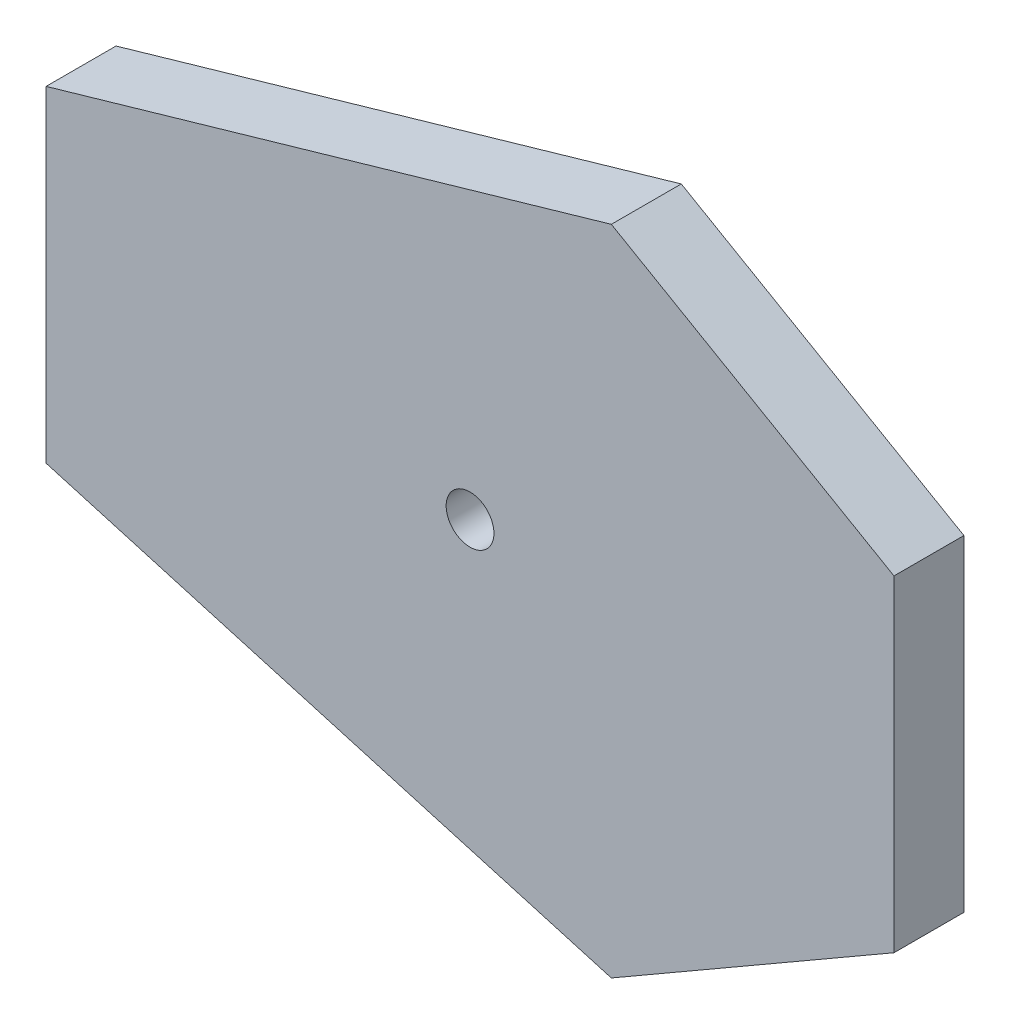
ISO-10303-21;
HEADER;
FILE_DESCRIPTION(('STEP AP214'),'2;1');
FILE_NAME('part.step','',(''),(''),'','','');
FILE_SCHEMA(('AUTOMOTIVE_DESIGN { 1 0 10303 214 1 1 1 1 }'));
ENDSEC;
DATA;
#1=APPLICATION_CONTEXT('core data for automotive mechanical design processes');
#2=APPLICATION_PROTOCOL_DEFINITION('international standard','automotive_design',2000,#1);
#3=PRODUCT_CONTEXT('',#1,'mechanical');
#4=PRODUCT('Part','Part','',(#3));
#5=PRODUCT_RELATED_PRODUCT_CATEGORY('part','',(#4));
#6=PRODUCT_DEFINITION_FORMATION('','',#4);
#7=PRODUCT_DEFINITION_CONTEXT('part definition',#1,'design');
#8=PRODUCT_DEFINITION('design','',#6,#7);
#9=PRODUCT_DEFINITION_SHAPE('','',#8);
#10=(LENGTH_UNIT() NAMED_UNIT(*) SI_UNIT(.MILLI.,.METRE.));
#11=(NAMED_UNIT(*) PLANE_ANGLE_UNIT() SI_UNIT($,.RADIAN.));
#12=(NAMED_UNIT(*) SI_UNIT($,.STERADIAN.) SOLID_ANGLE_UNIT());
#13=UNCERTAINTY_MEASURE_WITH_UNIT(LENGTH_MEASURE(1.E-05),#10,'distance_accuracy_value','');
#14=(GEOMETRIC_REPRESENTATION_CONTEXT(3) GLOBAL_UNCERTAINTY_ASSIGNED_CONTEXT((#13)) GLOBAL_UNIT_ASSIGNED_CONTEXT((#10,
#11,#12)) REPRESENTATION_CONTEXT('',''));
#15=CARTESIAN_POINT('',(0.,0.,0.));
#16=DIRECTION('',(0.,0.,1.));
#17=DIRECTION('',(1.,0.,0.));
#18=AXIS2_PLACEMENT_3D('',#15,#16,#17);
#19=CARTESIAN_POINT('',(-5.15,0.,6.));
#20=DIRECTION('',(0.,0.,-1.));
#21=DIRECTION('',(-1.,0.,0.));
#22=AXIS2_PLACEMENT_3D('',#19,#20,#21);
#23=CYLINDRICAL_SURFACE('',#22,2.05);
#24=CARTESIAN_POINT('',(-5.15,0.,6.));
#25=DIRECTION('',(0.,0.,1.));
#26=DIRECTION('',(1.,0.,0.));
#27=AXIS2_PLACEMENT_3D('',#24,#25,#26);
#28=CIRCLE('',#27,2.05);
#29=CARTESIAN_POINT('',(-3.1,0.,6.));
#30=VERTEX_POINT('',#29);
#31=EDGE_CURVE('E123',#30,#30,#28,.T.);
#32=ORIENTED_EDGE('',*,*,#31,.T.);
#33=EDGE_LOOP('',(#32));
#34=FACE_BOUND('',#33,.T.);
#35=CARTESIAN_POINT('',(-5.15,0.,3.));
#36=DIRECTION('',(0.,0.,-1.));
#37=DIRECTION('',(-1.,0.,0.));
#38=AXIS2_PLACEMENT_3D('',#35,#36,#37);
#39=CIRCLE('',#38,2.05);
#40=CARTESIAN_POINT('',(-7.2,0.,3.));
#41=VERTEX_POINT('',#40);
#42=EDGE_CURVE('E36',#41,#41,#39,.T.);
#43=ORIENTED_EDGE('',*,*,#42,.T.);
#44=EDGE_LOOP('',(#43));
#45=FACE_BOUND('',#44,.T.);
#46=ADVANCED_FACE('F32',(#34,#45),#23,.F.);
#47=CARTESIAN_POINT('',(0.,0.,6.));
#48=DIRECTION('',(0.,0.,1.));
#49=DIRECTION('',(1.,0.,0.));
#50=AXIS2_PLACEMENT_3D('',#47,#48,#49);
#51=PLANE('',#50);
#52=DIRECTION('',(-0.960768922830523,-0.277350098112614,0.));
#53=VECTOR('',#52,1.);
#54=CARTESIAN_POINT('',(-41.5230669589465,14.,6.));
#55=LINE('',#54,#53);
#56=CARTESIAN_POINT('',(6.97435565298217,28.,6.));
#57=VERTEX_POINT('',#56);
#58=CARTESIAN_POINT('',(-41.5230669589465,14.,6.));
#59=VERTEX_POINT('',#58);
#60=EDGE_CURVE('E130',#57,#59,#55,.T.);
#61=ORIENTED_EDGE('',*,*,#60,.T.);
#62=DIRECTION('',(0.,-1.,0.));
#63=VECTOR('',#62,1.);
#64=CARTESIAN_POINT('',(-41.5230669589465,14.,6.));
#65=LINE('',#64,#63);
#66=CARTESIAN_POINT('',(-41.5230669589465,-14.,6.));
#67=VERTEX_POINT('',#66);
#68=EDGE_CURVE('E87',#59,#67,#65,.T.);
#69=ORIENTED_EDGE('',*,*,#68,.T.);
#70=DIRECTION('',(0.960768922830523,-0.277350098112614,0.));
#71=VECTOR('',#70,1.);
#72=CARTESIAN_POINT('',(6.97435565298217,-28.,6.));
#73=LINE('',#72,#71);
#74=CARTESIAN_POINT('',(6.97435565298217,-28.,6.));
#75=VERTEX_POINT('',#74);
#76=EDGE_CURVE('E101',#67,#75,#73,.T.);
#77=ORIENTED_EDGE('',*,*,#76,.T.);
#78=DIRECTION('',(0.866025403784439,0.5,0.));
#79=VECTOR('',#78,1.);
#80=CARTESIAN_POINT('',(6.97435565298217,-28.,6.));
#81=LINE('',#80,#79);
#82=CARTESIAN_POINT('',(31.2230669589464,-14.,6.));
#83=VERTEX_POINT('',#82);
#84=EDGE_CURVE('E94',#75,#83,#81,.T.);
#85=ORIENTED_EDGE('',*,*,#84,.T.);
#86=DIRECTION('',(0.,1.,0.));
#87=VECTOR('',#86,1.);
#88=CARTESIAN_POINT('',(31.2230669589464,-14.,6.));
#89=LINE('',#88,#87);
#90=CARTESIAN_POINT('',(31.2230669589464,14.,6.));
#91=VERTEX_POINT('',#90);
#92=EDGE_CURVE('E99',#83,#91,#89,.T.);
#93=ORIENTED_EDGE('',*,*,#92,.T.);
#94=DIRECTION('',(-0.866025403784439,0.5,0.));
#95=VECTOR('',#94,1.);
#96=CARTESIAN_POINT('',(31.2230669589464,14.,6.));
#97=LINE('',#96,#95);
#98=EDGE_CURVE('E50',#91,#57,#97,.T.);
#99=ORIENTED_EDGE('',*,*,#98,.T.);
#100=EDGE_LOOP('',(#61,#69,#77,#85,#93,#99));
#101=FACE_BOUND('',#100,.T.);
#102=ORIENTED_EDGE('',*,*,#31,.F.);
#103=EDGE_LOOP('',(#102));
#104=FACE_BOUND('',#103,.T.);
#105=ADVANCED_FACE('F96',(#101,#104),#51,.T.);
#106=CARTESIAN_POINT('',(0.,0.,0.));
#107=DIRECTION('',(0.,0.,1.));
#108=DIRECTION('',(1.,0.,0.));
#109=AXIS2_PLACEMENT_3D('',#106,#107,#108);
#110=PLANE('',#109);
#111=CARTESIAN_POINT('',(-5.15000000000038,-1.45716771982052E-13,0.));
#112=DIRECTION('',(0.,0.,-1.));
#113=DIRECTION('',(-1.,0.,0.));
#114=AXIS2_PLACEMENT_3D('',#111,#112,#113);
#115=CIRCLE('',#114,2.1);
#116=CARTESIAN_POINT('',(-7.25000000000038,-1.45716771982052E-13,0.));
#117=VERTEX_POINT('',#116);
#118=EDGE_CURVE('E175',#117,#117,#115,.T.);
#119=ORIENTED_EDGE('',*,*,#118,.F.);
#120=EDGE_LOOP('',(#119));
#121=FACE_BOUND('',#120,.T.);
#122=DIRECTION('',(-0.960768922830523,-0.277350098112614,0.));
#123=VECTOR('',#122,1.);
#124=CARTESIAN_POINT('',(-41.5230669589465,14.,0.));
#125=LINE('',#124,#123);
#126=CARTESIAN_POINT('',(6.97435565298217,28.,0.));
#127=VERTEX_POINT('',#126);
#128=CARTESIAN_POINT('',(-41.5230669589465,14.,0.));
#129=VERTEX_POINT('',#128);
#130=EDGE_CURVE('E119',#127,#129,#125,.T.);
#131=ORIENTED_EDGE('',*,*,#130,.F.);
#132=DIRECTION('',(-0.866025403784439,0.5,0.));
#133=VECTOR('',#132,1.);
#134=CARTESIAN_POINT('',(31.2230669589464,14.,0.));
#135=LINE('',#134,#133);
#136=CARTESIAN_POINT('',(31.2230669589464,14.,0.));
#137=VERTEX_POINT('',#136);
#138=EDGE_CURVE('E79',#137,#127,#135,.T.);
#139=ORIENTED_EDGE('',*,*,#138,.F.);
#140=DIRECTION('',(0.,1.,0.));
#141=VECTOR('',#140,1.);
#142=CARTESIAN_POINT('',(31.2230669589464,-14.,0.));
#143=LINE('',#142,#141);
#144=CARTESIAN_POINT('',(31.2230669589464,-14.,0.));
#145=VERTEX_POINT('',#144);
#146=EDGE_CURVE('E73',#145,#137,#143,.T.);
#147=ORIENTED_EDGE('',*,*,#146,.F.);
#148=DIRECTION('',(0.866025403784439,0.5,0.));
#149=VECTOR('',#148,1.);
#150=CARTESIAN_POINT('',(6.97435565298217,-28.,0.));
#151=LINE('',#150,#149);
#152=CARTESIAN_POINT('',(6.97435565298217,-28.,0.));
#153=VERTEX_POINT('',#152);
#154=EDGE_CURVE('E109',#153,#145,#151,.T.);
#155=ORIENTED_EDGE('',*,*,#154,.F.);
#156=DIRECTION('',(0.960768922830523,-0.277350098112614,0.));
#157=VECTOR('',#156,1.);
#158=CARTESIAN_POINT('',(6.97435565298217,-28.,0.));
#159=LINE('',#158,#157);
#160=CARTESIAN_POINT('',(-41.5230669589465,-14.,0.));
#161=VERTEX_POINT('',#160);
#162=EDGE_CURVE('E125',#161,#153,#159,.T.);
#163=ORIENTED_EDGE('',*,*,#162,.F.);
#164=DIRECTION('',(0.,-1.,0.));
#165=VECTOR('',#164,1.);
#166=CARTESIAN_POINT('',(-41.5230669589465,14.,0.));
#167=LINE('',#166,#165);
#168=EDGE_CURVE('E122',#129,#161,#167,.T.);
#169=ORIENTED_EDGE('',*,*,#168,.F.);
#170=EDGE_LOOP('',(#131,#139,#147,#155,#163,#169));
#171=FACE_BOUND('',#170,.T.);
#172=ADVANCED_FACE('F140',(#121,#171),#110,.F.);
#173=CARTESIAN_POINT('',(-41.5230669589465,14.,6.));
#174=DIRECTION('',(0.277350098112614,-0.960768922830523,0.));
#175=DIRECTION('',(0.960768922830523,0.277350098112614,0.));
#176=AXIS2_PLACEMENT_3D('',#173,#174,#175);
#177=PLANE('',#176);
#178=ORIENTED_EDGE('',*,*,#130,.T.);
#179=DIRECTION('',(0.,0.,-1.));
#180=VECTOR('',#179,1.);
#181=CARTESIAN_POINT('',(-41.5230669589465,14.,6.));
#182=LINE('',#181,#180);
#183=EDGE_CURVE('E11',#59,#129,#182,.T.);
#184=ORIENTED_EDGE('',*,*,#183,.F.);
#185=ORIENTED_EDGE('',*,*,#60,.F.);
#186=DIRECTION('',(0.,0.,-1.));
#187=VECTOR('',#186,1.);
#188=CARTESIAN_POINT('',(6.97435565298217,28.,6.));
#189=LINE('',#188,#187);
#190=EDGE_CURVE('E115',#57,#127,#189,.T.);
#191=ORIENTED_EDGE('',*,*,#190,.T.);
#192=EDGE_LOOP('',(#178,#184,#185,#191));
#193=FACE_BOUND('',#192,.T.);
#194=ADVANCED_FACE('F34',(#193),#177,.F.);
#195=CARTESIAN_POINT('',(-41.5230669589465,14.,6.));
#196=DIRECTION('',(1.,0.,0.));
#197=DIRECTION('',(0.,0.,-1.));
#198=AXIS2_PLACEMENT_3D('',#195,#196,#197);
#199=PLANE('',#198);
#200=ORIENTED_EDGE('',*,*,#168,.T.);
#201=DIRECTION('',(0.,0.,-1.));
#202=VECTOR('',#201,1.);
#203=CARTESIAN_POINT('',(-41.5230669589465,-14.,6.));
#204=LINE('',#203,#202);
#205=EDGE_CURVE('E42',#67,#161,#204,.T.);
#206=ORIENTED_EDGE('',*,*,#205,.F.);
#207=ORIENTED_EDGE('',*,*,#68,.F.);
#208=ORIENTED_EDGE('',*,*,#183,.T.);
#209=EDGE_LOOP('',(#200,#206,#207,#208));
#210=FACE_BOUND('',#209,.T.);
#211=ADVANCED_FACE('F172',(#210),#199,.F.);
#212=CARTESIAN_POINT('',(6.97435565298217,-28.,6.));
#213=DIRECTION('',(0.277350098112614,0.960768922830523,0.));
#214=DIRECTION('',(-0.960768922830523,0.277350098112614,0.));
#215=AXIS2_PLACEMENT_3D('',#212,#213,#214);
#216=PLANE('',#215);
#217=ORIENTED_EDGE('',*,*,#162,.T.);
#218=DIRECTION('',(0.,0.,-1.));
#219=VECTOR('',#218,1.);
#220=CARTESIAN_POINT('',(6.97435565298217,-28.,6.));
#221=LINE('',#220,#219);
#222=EDGE_CURVE('E110',#75,#153,#221,.T.);
#223=ORIENTED_EDGE('',*,*,#222,.F.);
#224=ORIENTED_EDGE('',*,*,#76,.F.);
#225=ORIENTED_EDGE('',*,*,#205,.T.);
#226=EDGE_LOOP('',(#217,#223,#224,#225));
#227=FACE_BOUND('',#226,.T.);
#228=ADVANCED_FACE('F137',(#227),#216,.F.);
#229=CARTESIAN_POINT('',(6.97435565298217,-28.,6.));
#230=DIRECTION('',(-0.5,0.866025403784439,0.));
#231=DIRECTION('',(-0.866025403784439,-0.5,0.));
#232=AXIS2_PLACEMENT_3D('',#229,#230,#231);
#233=PLANE('',#232);
#234=ORIENTED_EDGE('',*,*,#154,.T.);
#235=DIRECTION('',(0.,0.,-1.));
#236=VECTOR('',#235,1.);
#237=CARTESIAN_POINT('',(31.2230669589464,-14.,6.));
#238=LINE('',#237,#236);
#239=EDGE_CURVE('E106',#83,#145,#238,.T.);
#240=ORIENTED_EDGE('',*,*,#239,.F.);
#241=ORIENTED_EDGE('',*,*,#84,.F.);
#242=ORIENTED_EDGE('',*,*,#222,.T.);
#243=EDGE_LOOP('',(#234,#240,#241,#242));
#244=FACE_BOUND('',#243,.T.);
#245=ADVANCED_FACE('F107',(#244),#233,.F.);
#246=CARTESIAN_POINT('',(31.2230669589464,-14.,6.));
#247=DIRECTION('',(-1.,0.,0.));
#248=DIRECTION('',(0.,0.,1.));
#249=AXIS2_PLACEMENT_3D('',#246,#247,#248);
#250=PLANE('',#249);
#251=ORIENTED_EDGE('',*,*,#146,.T.);
#252=DIRECTION('',(0.,0.,-1.));
#253=VECTOR('',#252,1.);
#254=CARTESIAN_POINT('',(31.2230669589464,14.,6.));
#255=LINE('',#254,#253);
#256=EDGE_CURVE('E111',#91,#137,#255,.T.);
#257=ORIENTED_EDGE('',*,*,#256,.F.);
#258=ORIENTED_EDGE('',*,*,#92,.F.);
#259=ORIENTED_EDGE('',*,*,#239,.T.);
#260=EDGE_LOOP('',(#251,#257,#258,#259));
#261=FACE_BOUND('',#260,.T.);
#262=ADVANCED_FACE('F113',(#261),#250,.F.);
#263=CARTESIAN_POINT('',(31.2230669589464,14.,6.));
#264=DIRECTION('',(-0.5,-0.866025403784439,0.));
#265=DIRECTION('',(0.866025403784439,-0.5,0.));
#266=AXIS2_PLACEMENT_3D('',#263,#264,#265);
#267=PLANE('',#266);
#268=ORIENTED_EDGE('',*,*,#138,.T.);
#269=ORIENTED_EDGE('',*,*,#190,.F.);
#270=ORIENTED_EDGE('',*,*,#98,.F.);
#271=ORIENTED_EDGE('',*,*,#256,.T.);
#272=EDGE_LOOP('',(#268,#269,#270,#271));
#273=FACE_BOUND('',#272,.T.);
#274=ADVANCED_FACE('F144',(#273),#267,.F.);
#275=CARTESIAN_POINT('',(-5.15000000000038,-1.45716771982052E-13,3.));
#276=DIRECTION('',(0.,0.,-1.));
#277=DIRECTION('',(-1.,0.,0.));
#278=AXIS2_PLACEMENT_3D('',#275,#276,#277);
#279=CYLINDRICAL_SURFACE('',#278,2.1);
#280=CARTESIAN_POINT('',(-5.15000000000038,-1.45716771982052E-13,3.));
#281=DIRECTION('',(0.,0.,-1.));
#282=DIRECTION('',(-1.,0.,0.));
#283=AXIS2_PLACEMENT_3D('',#280,#281,#282);
#284=CIRCLE('',#283,2.1);
#285=CARTESIAN_POINT('',(-7.25000000000038,-1.45716771982052E-13,3.));
#286=VERTEX_POINT('',#285);
#287=EDGE_CURVE('E177',#286,#286,#284,.T.);
#288=ORIENTED_EDGE('',*,*,#287,.F.);
#289=EDGE_LOOP('',(#288));
#290=FACE_BOUND('',#289,.T.);
#291=ORIENTED_EDGE('',*,*,#118,.T.);
#292=EDGE_LOOP('',(#291));
#293=FACE_BOUND('',#292,.T.);
#294=ADVANCED_FACE('F146',(#290,#293),#279,.F.);
#295=CARTESIAN_POINT('',(-5.15000000000038,-1.45716771982052E-13,3.));
#296=DIRECTION('',(0.,0.,-1.));
#297=DIRECTION('',(-1.,0.,0.));
#298=AXIS2_PLACEMENT_3D('',#295,#296,#297);
#299=PLANE('',#298);
#300=ORIENTED_EDGE('',*,*,#42,.F.);
#301=EDGE_LOOP('',(#300));
#302=FACE_BOUND('',#301,.T.);
#303=ORIENTED_EDGE('',*,*,#287,.T.);
#304=EDGE_LOOP('',(#303));
#305=FACE_BOUND('',#304,.T.);
#306=ADVANCED_FACE('F152',(#302,#305),#299,.T.);
#307=CLOSED_SHELL('',(#46,#105,#172,#194,#211,#228,#245,#262,#274,#294,#306));
#308=MANIFOLD_SOLID_BREP('B2',#307);
#309=ADVANCED_BREP_SHAPE_REPRESENTATION('',(#18,#308),#14);
#310=SHAPE_DEFINITION_REPRESENTATION(#9,#309);
ENDSEC;
END-ISO-10303-21;
